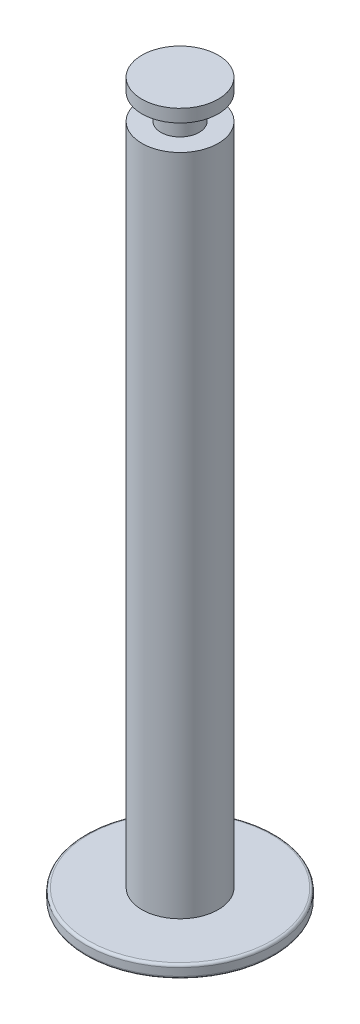
ISO-10303-21;
HEADER;
FILE_DESCRIPTION(('STEP AP214'),'2;1');
FILE_NAME('part.step','',(''),(''),'','','');
FILE_SCHEMA(('AUTOMOTIVE_DESIGN { 1 0 10303 214 1 1 1 1 }'));
ENDSEC;
DATA;
#1=APPLICATION_CONTEXT('core data for automotive mechanical design processes');
#2=APPLICATION_PROTOCOL_DEFINITION('international standard','automotive_design',2000,#1);
#3=PRODUCT_CONTEXT('',#1,'mechanical');
#4=PRODUCT('Part','Part','',(#3));
#5=PRODUCT_RELATED_PRODUCT_CATEGORY('part','',(#4));
#6=PRODUCT_DEFINITION_FORMATION('','',#4);
#7=PRODUCT_DEFINITION_CONTEXT('part definition',#1,'design');
#8=PRODUCT_DEFINITION('design','',#6,#7);
#9=PRODUCT_DEFINITION_SHAPE('','',#8);
#10=(LENGTH_UNIT() NAMED_UNIT(*) SI_UNIT(.MILLI.,.METRE.));
#11=(NAMED_UNIT(*) PLANE_ANGLE_UNIT() SI_UNIT($,.RADIAN.));
#12=(NAMED_UNIT(*) SI_UNIT($,.STERADIAN.) SOLID_ANGLE_UNIT());
#13=UNCERTAINTY_MEASURE_WITH_UNIT(LENGTH_MEASURE(1.E-05),#10,'distance_accuracy_value','');
#14=(GEOMETRIC_REPRESENTATION_CONTEXT(3) GLOBAL_UNCERTAINTY_ASSIGNED_CONTEXT((#13)) GLOBAL_UNIT_ASSIGNED_CONTEXT((#10,
#11,#12)) REPRESENTATION_CONTEXT('',''));
#15=CARTESIAN_POINT('',(0.,0.,0.));
#16=DIRECTION('',(0.,0.,1.));
#17=DIRECTION('',(1.,0.,0.));
#18=AXIS2_PLACEMENT_3D('',#15,#16,#17);
#19=CARTESIAN_POINT('',(0.,1.,0.));
#20=DIRECTION('',(0.,-1.,0.));
#21=DIRECTION('',(0.,0.,-1.));
#22=AXIS2_PLACEMENT_3D('',#19,#20,#21);
#23=CYLINDRICAL_SURFACE('',#22,7.39);
#24=CARTESIAN_POINT('',(0.,0.2,0.));
#25=DIRECTION('',(0.,1.,0.));
#26=DIRECTION('',(0.,0.,1.));
#27=AXIS2_PLACEMENT_3D('',#24,#25,#26);
#28=CIRCLE('',#27,7.39);
#29=CARTESIAN_POINT('',(0.,0.2,7.39));
#30=VERTEX_POINT('',#29);
#31=EDGE_CURVE('E64',#30,#30,#28,.T.);
#32=ORIENTED_EDGE('',*,*,#31,.T.);
#33=EDGE_LOOP('',(#32));
#34=FACE_BOUND('',#33,.T.);
#35=CARTESIAN_POINT('',(0.,0.8,0.));
#36=DIRECTION('',(0.,1.,0.));
#37=DIRECTION('',(0.,0.,1.));
#38=AXIS2_PLACEMENT_3D('',#35,#36,#37);
#39=CIRCLE('',#38,7.39);
#40=CARTESIAN_POINT('',(0.,0.8,7.39));
#41=VERTEX_POINT('',#40);
#42=EDGE_CURVE('E58',#41,#41,#39,.F.);
#43=ORIENTED_EDGE('',*,*,#42,.T.);
#44=EDGE_LOOP('',(#43));
#45=FACE_BOUND('',#44,.T.);
#46=ADVANCED_FACE('F38',(#34,#45),#23,.T.);
#47=CARTESIAN_POINT('',(0.,1.,0.));
#48=DIRECTION('',(0.,1.,0.));
#49=DIRECTION('',(0.,0.,1.));
#50=AXIS2_PLACEMENT_3D('',#47,#48,#49);
#51=PLANE('',#50);
#52=CARTESIAN_POINT('',(0.,1.,0.));
#53=DIRECTION('',(0.,1.,0.));
#54=DIRECTION('',(0.,0.,1.));
#55=AXIS2_PLACEMENT_3D('',#52,#53,#54);
#56=CIRCLE('',#55,2.99);
#57=CARTESIAN_POINT('',(0.,1.,-2.99));
#58=VERTEX_POINT('',#57);
#59=EDGE_CURVE('E59',#58,#58,#56,.T.);
#60=ORIENTED_EDGE('',*,*,#59,.F.);
#61=EDGE_LOOP('',(#60));
#62=FACE_BOUND('',#61,.T.);
#63=CARTESIAN_POINT('',(0.,1.,0.));
#64=DIRECTION('',(0.,1.,0.));
#65=DIRECTION('',(0.,0.,1.));
#66=AXIS2_PLACEMENT_3D('',#63,#64,#65);
#67=CIRCLE('',#66,7.19);
#68=CARTESIAN_POINT('',(0.,1.,7.19));
#69=VERTEX_POINT('',#68);
#70=EDGE_CURVE('E42',#69,#69,#67,.T.);
#71=ORIENTED_EDGE('',*,*,#70,.T.);
#72=EDGE_LOOP('',(#71));
#73=FACE_BOUND('',#72,.T.);
#74=ADVANCED_FACE('F78',(#62,#73),#51,.T.);
#75=CARTESIAN_POINT('',(0.,0.,0.));
#76=DIRECTION('',(0.,1.,0.));
#77=DIRECTION('',(0.,0.,1.));
#78=AXIS2_PLACEMENT_3D('',#75,#76,#77);
#79=PLANE('',#78);
#80=CARTESIAN_POINT('',(0.,0.,0.));
#81=DIRECTION('',(0.,1.,0.));
#82=DIRECTION('',(0.,0.,1.));
#83=AXIS2_PLACEMENT_3D('',#80,#81,#82);
#84=CIRCLE('',#83,7.19);
#85=CARTESIAN_POINT('',(0.,0.,7.19));
#86=VERTEX_POINT('',#85);
#87=EDGE_CURVE('E50',#86,#86,#84,.F.);
#88=ORIENTED_EDGE('',*,*,#87,.T.);
#89=EDGE_LOOP('',(#88));
#90=FACE_BOUND('',#89,.T.);
#91=ADVANCED_FACE('F69',(#90),#79,.F.);
#92=CARTESIAN_POINT('',(0.,0.2,0.));
#93=DIRECTION('',(0.,1.,0.));
#94=DIRECTION('',(0.,0.,1.));
#95=AXIS2_PLACEMENT_3D('',#92,#93,#94);
#96=TOROIDAL_SURFACE('',#95,7.19,0.2);
#97=ORIENTED_EDGE('',*,*,#87,.F.);
#98=EDGE_LOOP('',(#97));
#99=FACE_BOUND('',#98,.T.);
#100=ORIENTED_EDGE('',*,*,#31,.F.);
#101=EDGE_LOOP('',(#100));
#102=FACE_BOUND('',#101,.T.);
#103=ADVANCED_FACE('F71',(#99,#102),#96,.T.);
#104=CARTESIAN_POINT('',(0.,0.8,0.));
#105=DIRECTION('',(0.,1.,0.));
#106=DIRECTION('',(0.,0.,1.));
#107=AXIS2_PLACEMENT_3D('',#104,#105,#106);
#108=TOROIDAL_SURFACE('',#107,7.19,0.2);
#109=ORIENTED_EDGE('',*,*,#42,.F.);
#110=EDGE_LOOP('',(#109));
#111=FACE_BOUND('',#110,.T.);
#112=ORIENTED_EDGE('',*,*,#70,.F.);
#113=EDGE_LOOP('',(#112));
#114=FACE_BOUND('',#113,.T.);
#115=ADVANCED_FACE('F40',(#111,#114),#108,.T.);
#116=CARTESIAN_POINT('',(0.,53.,0.));
#117=DIRECTION('',(0.,-1.,0.));
#118=DIRECTION('',(0.,0.,-1.));
#119=AXIS2_PLACEMENT_3D('',#116,#117,#118);
#120=CYLINDRICAL_SURFACE('',#119,2.99);
#121=CARTESIAN_POINT('',(0.,53.,0.));
#122=DIRECTION('',(0.,1.,0.));
#123=DIRECTION('',(0.,0.,1.));
#124=AXIS2_PLACEMENT_3D('',#121,#122,#123);
#125=CIRCLE('',#124,2.99);
#126=CARTESIAN_POINT('',(0.,53.,-2.99));
#127=VERTEX_POINT('',#126);
#128=EDGE_CURVE('E55',#127,#127,#125,.T.);
#129=CARTESIAN_POINT('',(0.,53.,-2.99));
#130=CARTESIAN_POINT('',(0.,52.4583333333333,-2.99));
#131=CARTESIAN_POINT('',(0.,51.9166666666667,-2.99));
#132=CARTESIAN_POINT('',(0.,50.8333333333333,-2.99));
#133=CARTESIAN_POINT('',(0.,50.2916666666667,-2.99));
#134=CARTESIAN_POINT('',(0.,49.2083333333333,-2.99));
#135=CARTESIAN_POINT('',(0.,48.6666666666667,-2.99));
#136=CARTESIAN_POINT('',(0.,47.5833333333333,-2.99));
#137=CARTESIAN_POINT('',(0.,47.0416666666667,-2.99));
#138=CARTESIAN_POINT('',(0.,45.9583333333333,-2.99));
#139=CARTESIAN_POINT('',(0.,45.4166666666667,-2.99));
#140=CARTESIAN_POINT('',(0.,44.3333333333333,-2.99));
#141=CARTESIAN_POINT('',(0.,43.7916666666667,-2.99));
#142=CARTESIAN_POINT('',(0.,42.7083333333333,-2.99));
#143=CARTESIAN_POINT('',(0.,42.1666666666667,-2.99));
#144=CARTESIAN_POINT('',(0.,41.0833333333333,-2.99));
#145=CARTESIAN_POINT('',(0.,40.5416666666667,-2.99));
#146=CARTESIAN_POINT('',(0.,39.4583333333333,-2.99));
#147=CARTESIAN_POINT('',(0.,38.9166666666667,-2.99));
#148=CARTESIAN_POINT('',(0.,37.8333333333333,-2.99));
#149=CARTESIAN_POINT('',(0.,37.2916666666667,-2.99));
#150=CARTESIAN_POINT('',(0.,36.2083333333333,-2.99));
#151=CARTESIAN_POINT('',(0.,35.6666666666667,-2.99));
#152=CARTESIAN_POINT('',(0.,34.5833333333333,-2.99));
#153=CARTESIAN_POINT('',(0.,34.0416666666667,-2.99));
#154=CARTESIAN_POINT('',(0.,32.9583333333333,-2.99));
#155=CARTESIAN_POINT('',(0.,32.4166666666667,-2.99));
#156=CARTESIAN_POINT('',(0.,31.3333333333333,-2.99));
#157=CARTESIAN_POINT('',(0.,30.7916666666667,-2.99));
#158=CARTESIAN_POINT('',(0.,29.7083333333333,-2.99));
#159=CARTESIAN_POINT('',(0.,29.1666666666667,-2.99));
#160=CARTESIAN_POINT('',(0.,28.0833333333333,-2.99));
#161=CARTESIAN_POINT('',(0.,27.5416666666667,-2.99));
#162=CARTESIAN_POINT('',(0.,26.4583333333333,-2.99));
#163=CARTESIAN_POINT('',(0.,25.9166666666667,-2.99));
#164=CARTESIAN_POINT('',(0.,24.8333333333333,-2.99));
#165=CARTESIAN_POINT('',(0.,24.2916666666667,-2.99));
#166=CARTESIAN_POINT('',(0.,23.2083333333333,-2.99));
#167=CARTESIAN_POINT('',(0.,22.6666666666667,-2.99));
#168=CARTESIAN_POINT('',(0.,21.5833333333333,-2.99));
#169=CARTESIAN_POINT('',(0.,21.0416666666667,-2.99));
#170=CARTESIAN_POINT('',(0.,19.9583333333333,-2.99));
#171=CARTESIAN_POINT('',(0.,19.4166666666667,-2.99));
#172=CARTESIAN_POINT('',(0.,18.3333333333333,-2.99));
#173=CARTESIAN_POINT('',(0.,17.7916666666667,-2.99));
#174=CARTESIAN_POINT('',(0.,16.7083333333333,-2.99));
#175=CARTESIAN_POINT('',(0.,16.1666666666667,-2.99));
#176=CARTESIAN_POINT('',(0.,15.0833333333333,-2.99));
#177=CARTESIAN_POINT('',(0.,14.5416666666667,-2.99));
#178=CARTESIAN_POINT('',(0.,13.4583333333333,-2.99));
#179=CARTESIAN_POINT('',(0.,12.9166666666667,-2.99));
#180=CARTESIAN_POINT('',(0.,11.8333333333333,-2.99));
#181=CARTESIAN_POINT('',(0.,11.2916666666667,-2.99));
#182=CARTESIAN_POINT('',(0.,10.2083333333333,-2.99));
#183=CARTESIAN_POINT('',(0.,9.66666666666667,-2.99));
#184=CARTESIAN_POINT('',(0.,8.58333333333333,-2.99));
#185=CARTESIAN_POINT('',(0.,8.04166666666667,-2.99));
#186=CARTESIAN_POINT('',(0.,6.95833333333333,-2.99));
#187=CARTESIAN_POINT('',(0.,6.41666666666667,-2.99));
#188=CARTESIAN_POINT('',(0.,5.33333333333333,-2.99));
#189=CARTESIAN_POINT('',(0.,4.79166666666667,-2.99));
#190=CARTESIAN_POINT('',(0.,3.70833333333334,-2.99));
#191=CARTESIAN_POINT('',(0.,3.16666666666667,-2.99));
#192=CARTESIAN_POINT('',(0.,2.08333333333334,-2.99));
#193=CARTESIAN_POINT('',(0.,1.54166666666667,-2.99));
#194=CARTESIAN_POINT('',(0.,1.,-2.99));
#195=B_SPLINE_CURVE_WITH_KNOTS('',3,(#129,#130,#131,#132,#133,#134,#135,#136,#137,#138,#139,
#140,#141,#142,#143,#144,#145,#146,#147,#148,#149,#150,#151,#152,#153,#154,#155,#156,#157,#158,
#159,#160,#161,#162,#163,#164,#165,#166,#167,#168,#169,#170,#171,#172,#173,#174,#175,#176,#177,
#178,#179,#180,#181,#182,#183,#184,#185,#186,#187,#188,#189,#190,#191,#192,#193,#194),
.UNSPECIFIED.,.F.,.F.,(4,2,2,2,2,2,2,2,2,2,2,2,2,2,2,2,2,2,2,2,2,2,2,2,2,2,2,2,2,2,2,2,4),(0.,
1.625,3.25,4.875,6.50000000000001,8.125,9.75,11.375,13.,14.625,16.25,17.875,19.5,21.125,22.75,
24.375,26.,27.625,29.25,30.875,32.5,34.125,35.75,37.375,39.,40.625,42.25,43.875,45.5,47.125,
48.75,50.375,52.),.UNSPECIFIED.);
#196=EDGE_CURVE('BSEAM84',#127,#58,#195,.T.);
#197=ORIENTED_EDGE('',*,*,#128,.F.);
#198=ORIENTED_EDGE('',*,*,#59,.T.);
#199=ORIENTED_EDGE('',*,*,#196,.T.);
#200=ORIENTED_EDGE('',*,*,#196,.F.);
#201=EDGE_LOOP('',(#197,#199,#198,#200));
#202=FACE_BOUND('',#201,.T.);
#203=ADVANCED_FACE('F84',(#202),#120,.T.);
#204=CARTESIAN_POINT('',(0.,53.,0.));
#205=DIRECTION('',(0.,1.,0.));
#206=DIRECTION('',(0.,0.,1.));
#207=AXIS2_PLACEMENT_3D('',#204,#205,#206);
#208=PLANE('',#207);
#209=CARTESIAN_POINT('',(0.,53.,0.));
#210=DIRECTION('',(0.,1.,0.));
#211=DIRECTION('',(0.,0.,1.));
#212=AXIS2_PLACEMENT_3D('',#209,#210,#211);
#213=CIRCLE('',#212,1.5);
#214=CARTESIAN_POINT('',(0.,53.,1.5));
#215=VERTEX_POINT('',#214);
#216=EDGE_CURVE('E10',#215,#215,#213,.T.);
#217=ORIENTED_EDGE('',*,*,#216,.F.);
#218=EDGE_LOOP('',(#217));
#219=FACE_BOUND('',#218,.T.);
#220=ORIENTED_EDGE('',*,*,#128,.T.);
#221=EDGE_LOOP('',(#220));
#222=FACE_BOUND('',#221,.T.);
#223=ADVANCED_FACE('F98',(#219,#222),#208,.T.);
#224=CARTESIAN_POINT('',(0.,55.,0.));
#225=DIRECTION('',(0.,-1.,0.));
#226=DIRECTION('',(0.,0.,-1.));
#227=AXIS2_PLACEMENT_3D('',#224,#225,#226);
#228=CYLINDRICAL_SURFACE('',#227,1.5);
#229=CARTESIAN_POINT('',(0.,55.,0.));
#230=DIRECTION('',(0.,1.,0.));
#231=DIRECTION('',(0.,0.,1.));
#232=AXIS2_PLACEMENT_3D('',#229,#230,#231);
#233=CIRCLE('',#232,1.5);
#234=CARTESIAN_POINT('',(0.,55.,1.5));
#235=VERTEX_POINT('',#234);
#236=EDGE_CURVE('E53',#235,#235,#233,.T.);
#237=ORIENTED_EDGE('',*,*,#236,.F.);
#238=EDGE_LOOP('',(#237));
#239=FACE_BOUND('',#238,.T.);
#240=ORIENTED_EDGE('',*,*,#216,.T.);
#241=EDGE_LOOP('',(#240));
#242=FACE_BOUND('',#241,.T.);
#243=ADVANCED_FACE('F102',(#239,#242),#228,.T.);
#244=CARTESIAN_POINT('',(0.,56.,0.));
#245=DIRECTION('',(0.,-1.,0.));
#246=DIRECTION('',(0.,0.,-1.));
#247=AXIS2_PLACEMENT_3D('',#244,#245,#246);
#248=CYLINDRICAL_SURFACE('',#247,2.99);
#249=CARTESIAN_POINT('',(0.,56.,0.));
#250=DIRECTION('',(0.,1.,0.));
#251=DIRECTION('',(0.,0.,1.));
#252=AXIS2_PLACEMENT_3D('',#249,#250,#251);
#253=CIRCLE('',#252,2.99);
#254=CARTESIAN_POINT('',(0.,56.,2.99));
#255=VERTEX_POINT('',#254);
#256=EDGE_CURVE('E122',#255,#255,#253,.T.);
#257=ORIENTED_EDGE('',*,*,#256,.F.);
#258=EDGE_LOOP('',(#257));
#259=FACE_BOUND('',#258,.T.);
#260=CARTESIAN_POINT('',(0.,55.,0.));
#261=DIRECTION('',(0.,1.,0.));
#262=DIRECTION('',(0.,0.,1.));
#263=AXIS2_PLACEMENT_3D('',#260,#261,#262);
#264=CIRCLE('',#263,2.99);
#265=CARTESIAN_POINT('',(0.,55.,2.99));
#266=VERTEX_POINT('',#265);
#267=EDGE_CURVE('E123',#266,#266,#264,.T.);
#268=ORIENTED_EDGE('',*,*,#267,.T.);
#269=EDGE_LOOP('',(#268));
#270=FACE_BOUND('',#269,.T.);
#271=ADVANCED_FACE('F106',(#259,#270),#248,.T.);
#272=CARTESIAN_POINT('',(0.,56.,0.));
#273=DIRECTION('',(0.,1.,0.));
#274=DIRECTION('',(0.,0.,1.));
#275=AXIS2_PLACEMENT_3D('',#272,#273,#274);
#276=PLANE('',#275);
#277=ORIENTED_EDGE('',*,*,#256,.T.);
#278=EDGE_LOOP('',(#277));
#279=FACE_BOUND('',#278,.T.);
#280=ADVANCED_FACE('F110',(#279),#276,.T.);
#281=CARTESIAN_POINT('',(0.,55.,0.));
#282=DIRECTION('',(0.,1.,0.));
#283=DIRECTION('',(0.,0.,1.));
#284=AXIS2_PLACEMENT_3D('',#281,#282,#283);
#285=PLANE('',#284);
#286=ORIENTED_EDGE('',*,*,#236,.T.);
#287=EDGE_LOOP('',(#286));
#288=FACE_BOUND('',#287,.T.);
#289=ORIENTED_EDGE('',*,*,#267,.F.);
#290=EDGE_LOOP('',(#289));
#291=FACE_BOUND('',#290,.T.);
#292=ADVANCED_FACE('F112',(#288,#291),#285,.F.);
#293=CLOSED_SHELL('',(#46,#74,#91,#103,#115,#203,#223,#243,#271,#280,#292));
#294=MANIFOLD_SOLID_BREP('B2',#293);
#295=ADVANCED_BREP_SHAPE_REPRESENTATION('',(#18,#294),#14);
#296=SHAPE_DEFINITION_REPRESENTATION(#9,#295);
ENDSEC;
END-ISO-10303-21;
